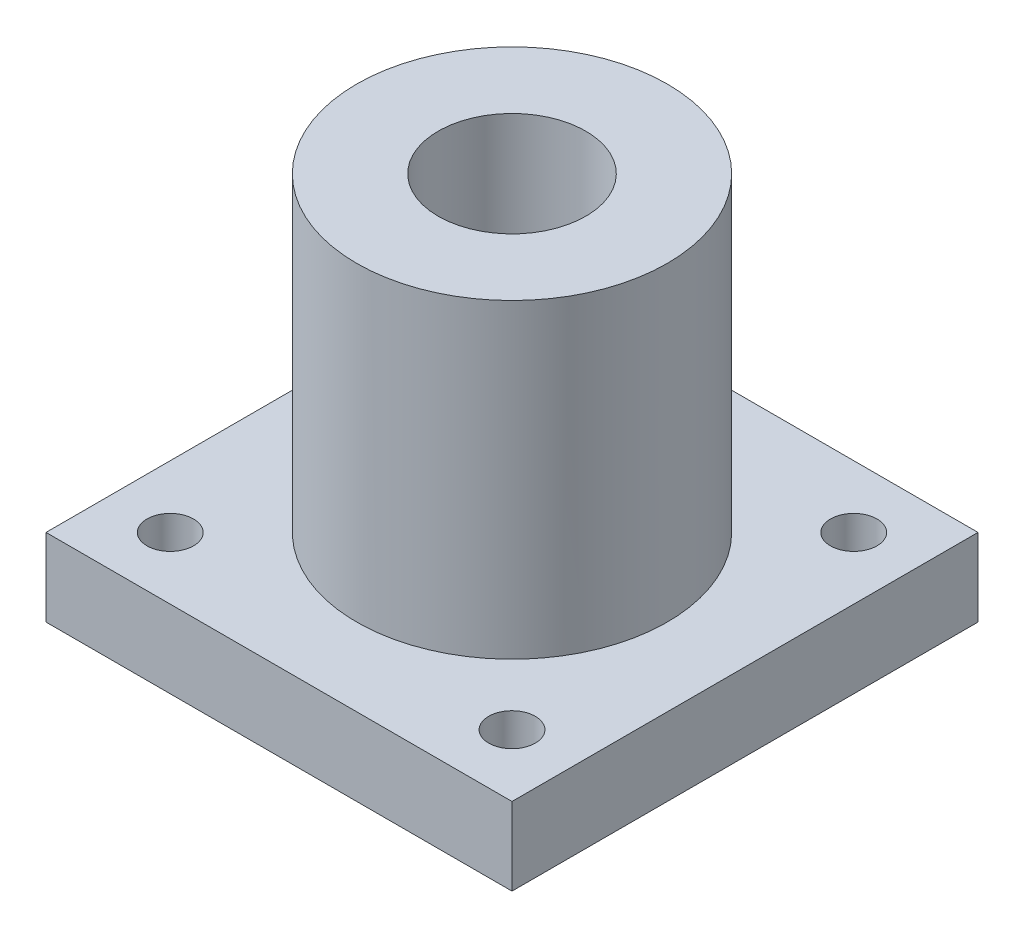
ISO-10303-21;
HEADER;
FILE_DESCRIPTION(('STEP AP214'),'2;1');
FILE_NAME('part.step','',(''),(''),'','','');
FILE_SCHEMA(('AUTOMOTIVE_DESIGN { 1 0 10303 214 1 1 1 1 }'));
ENDSEC;
DATA;
#1=APPLICATION_CONTEXT('core data for automotive mechanical design processes');
#2=APPLICATION_PROTOCOL_DEFINITION('international standard','automotive_design',2000,#1);
#3=PRODUCT_CONTEXT('',#1,'mechanical');
#4=PRODUCT('Part','Part','',(#3));
#5=PRODUCT_RELATED_PRODUCT_CATEGORY('part','',(#4));
#6=PRODUCT_DEFINITION_FORMATION('','',#4);
#7=PRODUCT_DEFINITION_CONTEXT('part definition',#1,'design');
#8=PRODUCT_DEFINITION('design','',#6,#7);
#9=PRODUCT_DEFINITION_SHAPE('','',#8);
#10=(LENGTH_UNIT() NAMED_UNIT(*) SI_UNIT(.MILLI.,.METRE.));
#11=(NAMED_UNIT(*) PLANE_ANGLE_UNIT() SI_UNIT($,.RADIAN.));
#12=(NAMED_UNIT(*) SI_UNIT($,.STERADIAN.) SOLID_ANGLE_UNIT());
#13=UNCERTAINTY_MEASURE_WITH_UNIT(LENGTH_MEASURE(1.E-05),#10,'distance_accuracy_value','');
#14=(GEOMETRIC_REPRESENTATION_CONTEXT(3) GLOBAL_UNCERTAINTY_ASSIGNED_CONTEXT((#13)) GLOBAL_UNIT_ASSIGNED_CONTEXT((#10,
#11,#12)) REPRESENTATION_CONTEXT('',''));
#15=CARTESIAN_POINT('',(0.,0.,0.));
#16=DIRECTION('',(0.,0.,1.));
#17=DIRECTION('',(1.,0.,0.));
#18=AXIS2_PLACEMENT_3D('',#15,#16,#17);
#19=CARTESIAN_POINT('',(0.,5.,0.));
#20=DIRECTION('',(0.,-1.,0.));
#21=DIRECTION('',(0.,0.,-1.));
#22=AXIS2_PLACEMENT_3D('',#19,#20,#21);
#23=PLANE('',#22);
#24=CARTESIAN_POINT('',(26.,5.,-26.));
#25=DIRECTION('',(0.,1.,0.));
#26=DIRECTION('',(0.,0.,1.));
#27=AXIS2_PLACEMENT_3D('',#24,#25,#26);
#28=CIRCLE('',#27,1.5);
#29=CARTESIAN_POINT('',(26.,5.,-24.5));
#30=VERTEX_POINT('',#29);
#31=EDGE_CURVE('E119',#30,#30,#28,.T.);
#32=ORIENTED_EDGE('',*,*,#31,.F.);
#33=EDGE_LOOP('',(#32));
#34=FACE_BOUND('',#33,.T.);
#35=CARTESIAN_POINT('',(26.,5.,-4.));
#36=DIRECTION('',(0.,1.,0.));
#37=DIRECTION('',(0.,0.,1.));
#38=AXIS2_PLACEMENT_3D('',#35,#36,#37);
#39=CIRCLE('',#38,1.5);
#40=CARTESIAN_POINT('',(26.,5.,-2.5));
#41=VERTEX_POINT('',#40);
#42=EDGE_CURVE('E236',#41,#41,#39,.T.);
#43=ORIENTED_EDGE('',*,*,#42,.F.);
#44=EDGE_LOOP('',(#43));
#45=FACE_BOUND('',#44,.T.);
#46=CARTESIAN_POINT('',(4.,5.,-4.));
#47=DIRECTION('',(0.,1.,0.));
#48=DIRECTION('',(0.,0.,1.));
#49=AXIS2_PLACEMENT_3D('',#46,#47,#48);
#50=CIRCLE('',#49,1.5);
#51=CARTESIAN_POINT('',(4.,5.,-2.5));
#52=VERTEX_POINT('',#51);
#53=EDGE_CURVE('E132',#52,#52,#50,.T.);
#54=ORIENTED_EDGE('',*,*,#53,.F.);
#55=EDGE_LOOP('',(#54));
#56=FACE_BOUND('',#55,.T.);
#57=CARTESIAN_POINT('',(4.,5.,-26.));
#58=DIRECTION('',(0.,1.,0.));
#59=DIRECTION('',(0.,0.,1.));
#60=AXIS2_PLACEMENT_3D('',#57,#58,#59);
#61=CIRCLE('',#60,1.5);
#62=CARTESIAN_POINT('',(4.,5.,-24.5));
#63=VERTEX_POINT('',#62);
#64=EDGE_CURVE('E115',#63,#63,#61,.T.);
#65=ORIENTED_EDGE('',*,*,#64,.F.);
#66=EDGE_LOOP('',(#65));
#67=FACE_BOUND('',#66,.T.);
#68=DIRECTION('',(0.,0.,1.));
#69=VECTOR('',#68,1.);
#70=CARTESIAN_POINT('',(0.,5.,0.));
#71=LINE('',#70,#69);
#72=CARTESIAN_POINT('',(0.,5.,-30.));
#73=VERTEX_POINT('',#72);
#74=CARTESIAN_POINT('',(0.,5.,0.));
#75=VERTEX_POINT('',#74);
#76=EDGE_CURVE('E87',#73,#75,#71,.T.);
#77=ORIENTED_EDGE('',*,*,#76,.T.);
#78=DIRECTION('',(1.,0.,0.));
#79=VECTOR('',#78,1.);
#80=CARTESIAN_POINT('',(0.,5.,0.));
#81=LINE('',#80,#79);
#82=CARTESIAN_POINT('',(30.,5.,0.));
#83=VERTEX_POINT('',#82);
#84=EDGE_CURVE('E82',#75,#83,#81,.T.);
#85=ORIENTED_EDGE('',*,*,#84,.T.);
#86=DIRECTION('',(0.,0.,-1.));
#87=VECTOR('',#86,1.);
#88=CARTESIAN_POINT('',(30.,5.,0.));
#89=LINE('',#88,#87);
#90=CARTESIAN_POINT('',(30.,5.,-30.));
#91=VERTEX_POINT('',#90);
#92=EDGE_CURVE('E85',#83,#91,#89,.T.);
#93=ORIENTED_EDGE('',*,*,#92,.T.);
#94=DIRECTION('',(-1.,0.,0.));
#95=VECTOR('',#94,1.);
#96=CARTESIAN_POINT('',(0.,5.,-30.));
#97=LINE('',#96,#95);
#98=EDGE_CURVE('E51',#91,#73,#97,.T.);
#99=ORIENTED_EDGE('',*,*,#98,.T.);
#100=EDGE_LOOP('',(#77,#85,#93,#99));
#101=FACE_BOUND('',#100,.T.);
#102=CARTESIAN_POINT('',(15.,5.,-15.));
#103=DIRECTION('',(0.,-1.,0.));
#104=DIRECTION('',(0.,0.,-1.));
#105=AXIS2_PLACEMENT_3D('',#102,#103,#104);
#106=CIRCLE('',#105,10.);
#107=CARTESIAN_POINT('',(15.,5.,-25.));
#108=VERTEX_POINT('',#107);
#109=EDGE_CURVE('E11',#108,#108,#106,.F.);
#110=ORIENTED_EDGE('',*,*,#109,.F.);
#111=EDGE_LOOP('',(#110));
#112=FACE_BOUND('',#111,.T.);
#113=ADVANCED_FACE('F32',(#34,#45,#56,#67,#101,#112),#23,.F.);
#114=CARTESIAN_POINT('',(0.,0.,0.));
#115=DIRECTION('',(0.,-1.,0.));
#116=DIRECTION('',(0.,0.,-1.));
#117=AXIS2_PLACEMENT_3D('',#114,#115,#116);
#118=PLANE('',#117);
#119=CARTESIAN_POINT('',(26.,0.,-26.));
#120=DIRECTION('',(0.,-1.,0.));
#121=DIRECTION('',(0.,0.,-1.));
#122=AXIS2_PLACEMENT_3D('',#119,#120,#121);
#123=CIRCLE('',#122,1.5);
#124=CARTESIAN_POINT('',(26.,0.,-27.5));
#125=VERTEX_POINT('',#124);
#126=EDGE_CURVE('E36',#125,#125,#123,.T.);
#127=ORIENTED_EDGE('',*,*,#126,.F.);
#128=EDGE_LOOP('',(#127));
#129=FACE_BOUND('',#128,.T.);
#130=CARTESIAN_POINT('',(26.,0.,-4.));
#131=DIRECTION('',(0.,-1.,0.));
#132=DIRECTION('',(0.,0.,-1.));
#133=AXIS2_PLACEMENT_3D('',#130,#131,#132);
#134=CIRCLE('',#133,1.5);
#135=CARTESIAN_POINT('',(26.,0.,-5.5));
#136=VERTEX_POINT('',#135);
#137=EDGE_CURVE('E118',#136,#136,#134,.T.);
#138=ORIENTED_EDGE('',*,*,#137,.F.);
#139=EDGE_LOOP('',(#138));
#140=FACE_BOUND('',#139,.T.);
#141=CARTESIAN_POINT('',(4.,0.,-4.));
#142=DIRECTION('',(0.,-1.,0.));
#143=DIRECTION('',(0.,0.,-1.));
#144=AXIS2_PLACEMENT_3D('',#141,#142,#143);
#145=CIRCLE('',#144,1.5);
#146=CARTESIAN_POINT('',(4.,0.,-5.5));
#147=VERTEX_POINT('',#146);
#148=EDGE_CURVE('E116',#147,#147,#145,.T.);
#149=ORIENTED_EDGE('',*,*,#148,.F.);
#150=EDGE_LOOP('',(#149));
#151=FACE_BOUND('',#150,.T.);
#152=CARTESIAN_POINT('',(4.,0.,-26.));
#153=DIRECTION('',(0.,-1.,0.));
#154=DIRECTION('',(0.,0.,-1.));
#155=AXIS2_PLACEMENT_3D('',#152,#153,#154);
#156=CIRCLE('',#155,1.5);
#157=CARTESIAN_POINT('',(4.,0.,-27.5));
#158=VERTEX_POINT('',#157);
#159=EDGE_CURVE('E111',#158,#158,#156,.T.);
#160=ORIENTED_EDGE('',*,*,#159,.F.);
#161=EDGE_LOOP('',(#160));
#162=FACE_BOUND('',#161,.T.);
#163=DIRECTION('',(0.,0.,1.));
#164=VECTOR('',#163,1.);
#165=CARTESIAN_POINT('',(0.,0.,0.));
#166=LINE('',#165,#164);
#167=CARTESIAN_POINT('',(0.,0.,-30.));
#168=VERTEX_POINT('',#167);
#169=CARTESIAN_POINT('',(0.,0.,0.));
#170=VERTEX_POINT('',#169);
#171=EDGE_CURVE('E101',#168,#170,#166,.T.);
#172=ORIENTED_EDGE('',*,*,#171,.F.);
#173=DIRECTION('',(-1.,0.,0.));
#174=VECTOR('',#173,1.);
#175=CARTESIAN_POINT('',(0.,0.,-30.));
#176=LINE('',#175,#174);
#177=CARTESIAN_POINT('',(30.,0.,-30.));
#178=VERTEX_POINT('',#177);
#179=EDGE_CURVE('E74',#178,#168,#176,.T.);
#180=ORIENTED_EDGE('',*,*,#179,.F.);
#181=DIRECTION('',(0.,0.,-1.));
#182=VECTOR('',#181,1.);
#183=CARTESIAN_POINT('',(30.,0.,0.));
#184=LINE('',#183,#182);
#185=CARTESIAN_POINT('',(30.,0.,0.));
#186=VERTEX_POINT('',#185);
#187=EDGE_CURVE('E68',#186,#178,#184,.T.);
#188=ORIENTED_EDGE('',*,*,#187,.F.);
#189=DIRECTION('',(1.,0.,0.));
#190=VECTOR('',#189,1.);
#191=CARTESIAN_POINT('',(0.,0.,0.));
#192=LINE('',#191,#190);
#193=EDGE_CURVE('E92',#170,#186,#192,.T.);
#194=ORIENTED_EDGE('',*,*,#193,.F.);
#195=EDGE_LOOP('',(#172,#180,#188,#194));
#196=FACE_BOUND('',#195,.T.);
#197=CARTESIAN_POINT('',(15.,0.,-15.));
#198=DIRECTION('',(0.,1.,0.));
#199=DIRECTION('',(0.,0.,1.));
#200=AXIS2_PLACEMENT_3D('',#197,#198,#199);
#201=CIRCLE('',#200,4.75);
#202=CARTESIAN_POINT('',(15.,0.,-10.25));
#203=VERTEX_POINT('',#202);
#204=EDGE_CURVE('E104',#203,#203,#201,.T.);
#205=ORIENTED_EDGE('',*,*,#204,.T.);
#206=EDGE_LOOP('',(#205));
#207=FACE_BOUND('',#206,.T.);
#208=ADVANCED_FACE('F142',(#129,#140,#151,#162,#196,#207),#118,.T.);
#209=CARTESIAN_POINT('',(0.,5.,0.));
#210=DIRECTION('',(1.,0.,0.));
#211=DIRECTION('',(0.,0.,-1.));
#212=AXIS2_PLACEMENT_3D('',#209,#210,#211);
#213=PLANE('',#212);
#214=ORIENTED_EDGE('',*,*,#171,.T.);
#215=DIRECTION('',(0.,-1.,0.));
#216=VECTOR('',#215,1.);
#217=CARTESIAN_POINT('',(0.,5.,0.));
#218=LINE('',#217,#216);
#219=EDGE_CURVE('E42',#75,#170,#218,.T.);
#220=ORIENTED_EDGE('',*,*,#219,.F.);
#221=ORIENTED_EDGE('',*,*,#76,.F.);
#222=DIRECTION('',(0.,-1.,0.));
#223=VECTOR('',#222,1.);
#224=CARTESIAN_POINT('',(0.,5.,-30.));
#225=LINE('',#224,#223);
#226=EDGE_CURVE('E97',#73,#168,#225,.T.);
#227=ORIENTED_EDGE('',*,*,#226,.T.);
#228=EDGE_LOOP('',(#214,#220,#221,#227));
#229=FACE_BOUND('',#228,.T.);
#230=ADVANCED_FACE('F34',(#229),#213,.F.);
#231=CARTESIAN_POINT('',(0.,5.,0.));
#232=DIRECTION('',(0.,0.,-1.));
#233=DIRECTION('',(-1.,0.,0.));
#234=AXIS2_PLACEMENT_3D('',#231,#232,#233);
#235=PLANE('',#234);
#236=ORIENTED_EDGE('',*,*,#193,.T.);
#237=DIRECTION('',(0.,-1.,0.));
#238=VECTOR('',#237,1.);
#239=CARTESIAN_POINT('',(30.,5.,0.));
#240=LINE('',#239,#238);
#241=EDGE_CURVE('E90',#83,#186,#240,.T.);
#242=ORIENTED_EDGE('',*,*,#241,.F.);
#243=ORIENTED_EDGE('',*,*,#84,.F.);
#244=ORIENTED_EDGE('',*,*,#219,.T.);
#245=EDGE_LOOP('',(#236,#242,#243,#244));
#246=FACE_BOUND('',#245,.T.);
#247=ADVANCED_FACE('F91',(#246),#235,.F.);
#248=CARTESIAN_POINT('',(30.,5.,0.));
#249=DIRECTION('',(-1.,0.,0.));
#250=DIRECTION('',(0.,0.,1.));
#251=AXIS2_PLACEMENT_3D('',#248,#249,#250);
#252=PLANE('',#251);
#253=ORIENTED_EDGE('',*,*,#187,.T.);
#254=DIRECTION('',(0.,-1.,0.));
#255=VECTOR('',#254,1.);
#256=CARTESIAN_POINT('',(30.,5.,-30.));
#257=LINE('',#256,#255);
#258=EDGE_CURVE('E93',#91,#178,#257,.T.);
#259=ORIENTED_EDGE('',*,*,#258,.F.);
#260=ORIENTED_EDGE('',*,*,#92,.F.);
#261=ORIENTED_EDGE('',*,*,#241,.T.);
#262=EDGE_LOOP('',(#253,#259,#260,#261));
#263=FACE_BOUND('',#262,.T.);
#264=ADVANCED_FACE('F95',(#263),#252,.F.);
#265=CARTESIAN_POINT('',(0.,5.,-30.));
#266=DIRECTION('',(0.,0.,1.));
#267=DIRECTION('',(1.,0.,0.));
#268=AXIS2_PLACEMENT_3D('',#265,#266,#267);
#269=PLANE('',#268);
#270=ORIENTED_EDGE('',*,*,#179,.T.);
#271=ORIENTED_EDGE('',*,*,#226,.F.);
#272=ORIENTED_EDGE('',*,*,#98,.F.);
#273=ORIENTED_EDGE('',*,*,#258,.T.);
#274=EDGE_LOOP('',(#270,#271,#272,#273));
#275=FACE_BOUND('',#274,.T.);
#276=ADVANCED_FACE('F148',(#275),#269,.F.);
#277=CARTESIAN_POINT('',(15.,5.,-15.));
#278=DIRECTION('',(0.,-1.,0.));
#279=DIRECTION('',(0.,0.,-1.));
#280=AXIS2_PLACEMENT_3D('',#277,#278,#279);
#281=CYLINDRICAL_SURFACE('',#280,4.75);
#282=ORIENTED_EDGE('',*,*,#204,.F.);
#283=EDGE_LOOP('',(#282));
#284=FACE_BOUND('',#283,.T.);
#285=CARTESIAN_POINT('',(15.,25.,-15.));
#286=DIRECTION('',(0.,1.,0.));
#287=DIRECTION('',(0.,0.,1.));
#288=AXIS2_PLACEMENT_3D('',#285,#286,#287);
#289=CIRCLE('',#288,4.75);
#290=CARTESIAN_POINT('',(15.,25.,-10.25));
#291=VERTEX_POINT('',#290);
#292=EDGE_CURVE('E114',#291,#291,#289,.T.);
#293=ORIENTED_EDGE('',*,*,#292,.T.);
#294=EDGE_LOOP('',(#293));
#295=FACE_BOUND('',#294,.T.);
#296=ADVANCED_FACE('F144',(#284,#295),#281,.F.);
#297=CARTESIAN_POINT('',(15.,25.,-15.));
#298=DIRECTION('',(0.,1.,0.));
#299=DIRECTION('',(0.,0.,1.));
#300=AXIS2_PLACEMENT_3D('',#297,#298,#299);
#301=PLANE('',#300);
#302=CARTESIAN_POINT('',(15.,25.,-15.));
#303=DIRECTION('',(0.,1.,0.));
#304=DIRECTION('',(0.,0.,1.));
#305=AXIS2_PLACEMENT_3D('',#302,#303,#304);
#306=CIRCLE('',#305,10.);
#307=CARTESIAN_POINT('',(15.,25.,-5.));
#308=VERTEX_POINT('',#307);
#309=EDGE_CURVE('E136',#308,#308,#306,.T.);
#310=ORIENTED_EDGE('',*,*,#309,.T.);
#311=EDGE_LOOP('',(#310));
#312=FACE_BOUND('',#311,.T.);
#313=ORIENTED_EDGE('',*,*,#292,.F.);
#314=EDGE_LOOP('',(#313));
#315=FACE_BOUND('',#314,.T.);
#316=ADVANCED_FACE('F147',(#312,#315),#301,.T.);
#317=CARTESIAN_POINT('',(15.,25.,-15.));
#318=DIRECTION('',(0.,-1.,0.));
#319=DIRECTION('',(0.,0.,-1.));
#320=AXIS2_PLACEMENT_3D('',#317,#318,#319);
#321=CYLINDRICAL_SURFACE('',#320,10.);
#322=ORIENTED_EDGE('',*,*,#309,.F.);
#323=EDGE_LOOP('',(#322));
#324=FACE_BOUND('',#323,.T.);
#325=ORIENTED_EDGE('',*,*,#109,.T.);
#326=EDGE_LOOP('',(#325));
#327=FACE_BOUND('',#326,.T.);
#328=ADVANCED_FACE('F153',(#324,#327),#321,.T.);
#329=CARTESIAN_POINT('',(4.,-2.,-26.));
#330=DIRECTION('',(0.,1.,0.));
#331=DIRECTION('',(0.,0.,1.));
#332=AXIS2_PLACEMENT_3D('',#329,#330,#331);
#333=CYLINDRICAL_SURFACE('',#332,1.5);
#334=ORIENTED_EDGE('',*,*,#159,.T.);
#335=EDGE_LOOP('',(#334));
#336=FACE_BOUND('',#335,.T.);
#337=ORIENTED_EDGE('',*,*,#64,.T.);
#338=EDGE_LOOP('',(#337));
#339=FACE_BOUND('',#338,.T.);
#340=ADVANCED_FACE('F159',(#336,#339),#333,.F.);
#341=CARTESIAN_POINT('',(4.,-2.,-4.));
#342=DIRECTION('',(0.,1.,0.));
#343=DIRECTION('',(0.,0.,1.));
#344=AXIS2_PLACEMENT_3D('',#341,#342,#343);
#345=CYLINDRICAL_SURFACE('',#344,1.5);
#346=ORIENTED_EDGE('',*,*,#148,.T.);
#347=EDGE_LOOP('',(#346));
#348=FACE_BOUND('',#347,.T.);
#349=ORIENTED_EDGE('',*,*,#53,.T.);
#350=EDGE_LOOP('',(#349));
#351=FACE_BOUND('',#350,.T.);
#352=ADVANCED_FACE('F202',(#348,#351),#345,.F.);
#353=CARTESIAN_POINT('',(26.,-2.,-4.));
#354=DIRECTION('',(0.,1.,0.));
#355=DIRECTION('',(0.,0.,1.));
#356=AXIS2_PLACEMENT_3D('',#353,#354,#355);
#357=CYLINDRICAL_SURFACE('',#356,1.5);
#358=ORIENTED_EDGE('',*,*,#137,.T.);
#359=EDGE_LOOP('',(#358));
#360=FACE_BOUND('',#359,.T.);
#361=ORIENTED_EDGE('',*,*,#42,.T.);
#362=EDGE_LOOP('',(#361));
#363=FACE_BOUND('',#362,.T.);
#364=ADVANCED_FACE('F212',(#360,#363),#357,.F.);
#365=CARTESIAN_POINT('',(26.,-2.,-26.));
#366=DIRECTION('',(0.,1.,0.));
#367=DIRECTION('',(0.,0.,1.));
#368=AXIS2_PLACEMENT_3D('',#365,#366,#367);
#369=CYLINDRICAL_SURFACE('',#368,1.5);
#370=ORIENTED_EDGE('',*,*,#126,.T.);
#371=EDGE_LOOP('',(#370));
#372=FACE_BOUND('',#371,.T.);
#373=ORIENTED_EDGE('',*,*,#31,.T.);
#374=EDGE_LOOP('',(#373));
#375=FACE_BOUND('',#374,.T.);
#376=ADVANCED_FACE('F222',(#372,#375),#369,.F.);
#377=CLOSED_SHELL('',(#113,#208,#230,#247,#264,#276,#296,#316,#328,#340,#352,#364,#376));
#378=MANIFOLD_SOLID_BREP('B2',#377);
#379=ADVANCED_BREP_SHAPE_REPRESENTATION('',(#18,#378),#14);
#380=SHAPE_DEFINITION_REPRESENTATION(#9,#379);
ENDSEC;
END-ISO-10303-21;
